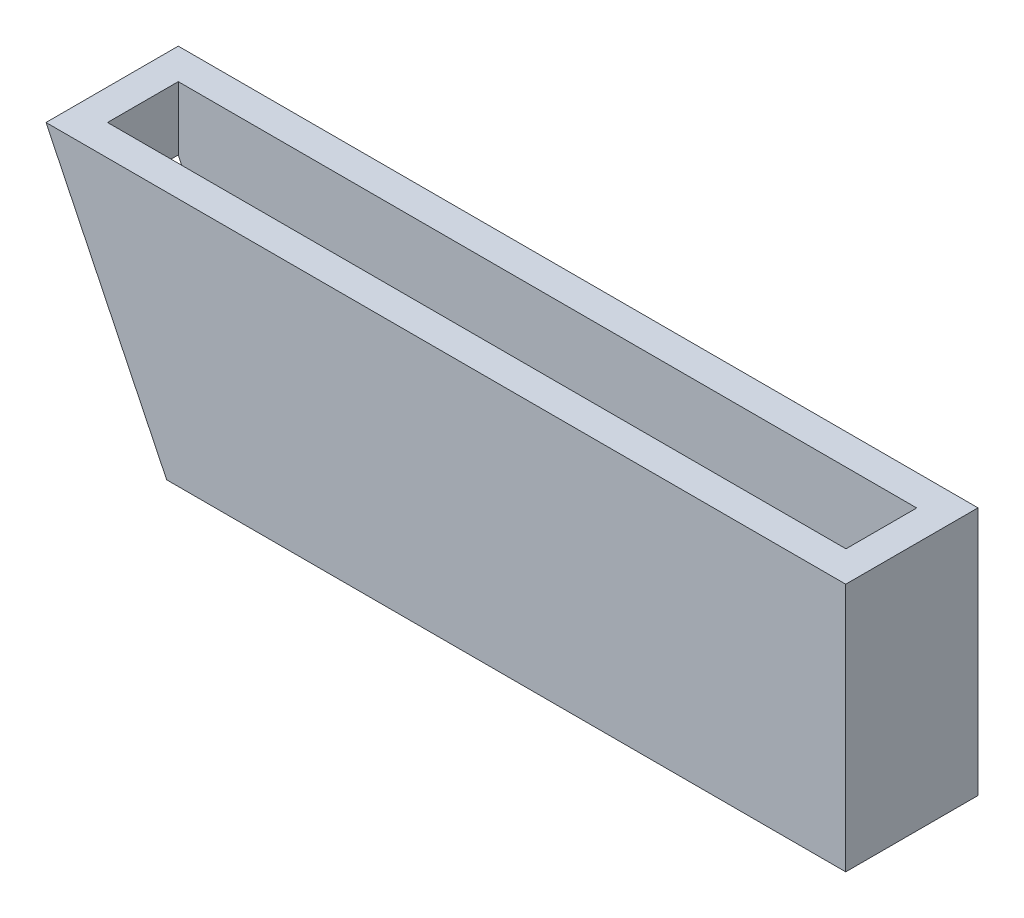
ISO-10303-21;
HEADER;
FILE_DESCRIPTION(('STEP AP214'),'2;1');
FILE_NAME('part.step','',(''),(''),'','','');
FILE_SCHEMA(('AUTOMOTIVE_DESIGN { 1 0 10303 214 1 1 1 1 }'));
ENDSEC;
DATA;
#1=APPLICATION_CONTEXT('core data for automotive mechanical design processes');
#2=APPLICATION_PROTOCOL_DEFINITION('international standard','automotive_design',2000,#1);
#3=PRODUCT_CONTEXT('',#1,'mechanical');
#4=PRODUCT('Part','Part','',(#3));
#5=PRODUCT_RELATED_PRODUCT_CATEGORY('part','',(#4));
#6=PRODUCT_DEFINITION_FORMATION('','',#4);
#7=PRODUCT_DEFINITION_CONTEXT('part definition',#1,'design');
#8=PRODUCT_DEFINITION('design','',#6,#7);
#9=PRODUCT_DEFINITION_SHAPE('','',#8);
#10=(LENGTH_UNIT() NAMED_UNIT(*) SI_UNIT(.MILLI.,.METRE.));
#11=(NAMED_UNIT(*) PLANE_ANGLE_UNIT() SI_UNIT($,.RADIAN.));
#12=(NAMED_UNIT(*) SI_UNIT($,.STERADIAN.) SOLID_ANGLE_UNIT());
#13=UNCERTAINTY_MEASURE_WITH_UNIT(LENGTH_MEASURE(1.E-05),#10,'distance_accuracy_value','');
#14=(GEOMETRIC_REPRESENTATION_CONTEXT(3) GLOBAL_UNCERTAINTY_ASSIGNED_CONTEXT((#13)) GLOBAL_UNIT_ASSIGNED_CONTEXT((#10,
#11,#12)) REPRESENTATION_CONTEXT('',''));
#15=CARTESIAN_POINT('',(0.,0.,0.));
#16=DIRECTION('',(0.,0.,1.));
#17=DIRECTION('',(1.,0.,0.));
#18=AXIS2_PLACEMENT_3D('',#15,#16,#17);
#19=CARTESIAN_POINT('',(0.,81.,10.));
#20=DIRECTION('',(0.,0.,-1.));
#21=DIRECTION('',(-1.,0.,0.));
#22=AXIS2_PLACEMENT_3D('',#19,#20,#21);
#23=PLANE('',#22);
#24=DIRECTION('',(1.,0.,0.));
#25=VECTOR('',#24,1.);
#26=CARTESIAN_POINT('',(0.,81.,10.));
#27=LINE('',#26,#25);
#28=CARTESIAN_POINT('',(0.,81.,10.0000000000001));
#29=VERTEX_POINT('',#28);
#30=CARTESIAN_POINT('',(260.,81.,10.));
#31=VERTEX_POINT('',#30);
#32=EDGE_CURVE('E126',#29,#31,#27,.T.);
#33=ORIENTED_EDGE('',*,*,#32,.F.);
#34=DIRECTION('',(0.435889894354068,-0.9,0.));
#35=VECTOR('',#34,1.);
#36=CARTESIAN_POINT('',(0.,81.,10.));
#37=LINE('',#36,#35);
#38=CARTESIAN_POINT('',(39.2300904918661,0.,10.0000000000001));
#39=VERTEX_POINT('',#38);
#40=EDGE_CURVE('E138',#29,#39,#37,.T.);
#41=ORIENTED_EDGE('',*,*,#40,.T.);
#42=DIRECTION('',(1.,0.,0.));
#43=VECTOR('',#42,1.);
#44=CARTESIAN_POINT('',(0.,0.,10.));
#45=LINE('',#44,#43);
#46=CARTESIAN_POINT('',(260.,0.,10.));
#47=VERTEX_POINT('',#46);
#48=EDGE_CURVE('E142',#39,#47,#45,.T.);
#49=ORIENTED_EDGE('',*,*,#48,.T.);
#50=DIRECTION('',(0.,-1.,0.));
#51=VECTOR('',#50,1.);
#52=CARTESIAN_POINT('',(260.,81.,10.));
#53=LINE('',#52,#51);
#54=EDGE_CURVE('E150',#31,#47,#53,.T.);
#55=ORIENTED_EDGE('',*,*,#54,.F.);
#56=EDGE_LOOP('',(#33,#41,#49,#55));
#57=FACE_BOUND('',#56,.T.);
#58=ADVANCED_FACE('F37',(#57),#23,.F.);
#59=CARTESIAN_POINT('',(260.,81.,0.));
#60=DIRECTION('',(-1.,0.,0.));
#61=DIRECTION('',(0.,0.,1.));
#62=AXIS2_PLACEMENT_3D('',#59,#60,#61);
#63=PLANE('',#62);
#64=DIRECTION('',(0.,0.,-1.));
#65=VECTOR('',#64,1.);
#66=CARTESIAN_POINT('',(260.,0.,0.));
#67=LINE('',#66,#65);
#68=CARTESIAN_POINT('',(260.,0.,-32.9985523775063));
#69=VERTEX_POINT('',#68);
#70=EDGE_CURVE('E144',#47,#69,#67,.T.);
#71=ORIENTED_EDGE('',*,*,#70,.T.);
#72=DIRECTION('',(0.,-1.,0.));
#73=VECTOR('',#72,1.);
#74=CARTESIAN_POINT('',(260.,81.,-32.9985523775063));
#75=LINE('',#74,#73);
#76=CARTESIAN_POINT('',(260.,81.,-32.9985523775063));
#77=VERTEX_POINT('',#76);
#78=EDGE_CURVE('E148',#77,#69,#75,.T.);
#79=ORIENTED_EDGE('',*,*,#78,.F.);
#80=DIRECTION('',(0.,0.,-1.));
#81=VECTOR('',#80,1.);
#82=CARTESIAN_POINT('',(260.,81.,0.));
#83=LINE('',#82,#81);
#84=EDGE_CURVE('E61',#31,#77,#83,.T.);
#85=ORIENTED_EDGE('',*,*,#84,.F.);
#86=ORIENTED_EDGE('',*,*,#54,.T.);
#87=EDGE_LOOP('',(#71,#79,#85,#86));
#88=FACE_BOUND('',#87,.T.);
#89=ADVANCED_FACE('F190',(#88),#63,.F.);
#90=CARTESIAN_POINT('',(0.,81.,0.));
#91=DIRECTION('',(0.,0.,-1.));
#92=DIRECTION('',(-1.,0.,0.));
#93=AXIS2_PLACEMENT_3D('',#90,#91,#92);
#94=PLANE('',#93);
#95=DIRECTION('',(0.435889894354068,-0.9,0.));
#96=VECTOR('',#95,1.);
#97=CARTESIAN_POINT('',(0.,81.,0.));
#98=LINE('',#97,#96);
#99=CARTESIAN_POINT('',(10.,60.3525839516494,0.));
#100=VERTEX_POINT('',#99);
#101=CARTESIAN_POINT('',(39.2300904918661,0.,0.));
#102=VERTEX_POINT('',#101);
#103=EDGE_CURVE('E182',#100,#102,#98,.T.);
#104=ORIENTED_EDGE('',*,*,#103,.F.);
#105=DIRECTION('',(0.,-1.,0.));
#106=VECTOR('',#105,1.);
#107=CARTESIAN_POINT('',(10.,81.,0.));
#108=LINE('',#107,#106);
#109=CARTESIAN_POINT('',(10.,81.,0.));
#110=VERTEX_POINT('',#109);
#111=EDGE_CURVE('E91',#110,#100,#108,.T.);
#112=ORIENTED_EDGE('',*,*,#111,.F.);
#113=DIRECTION('',(1.,0.,0.));
#114=VECTOR('',#113,1.);
#115=CARTESIAN_POINT('',(0.,81.,0.));
#116=LINE('',#115,#114);
#117=CARTESIAN_POINT('',(250.076193400082,81.,0.));
#118=VERTEX_POINT('',#117);
#119=EDGE_CURVE('E116',#110,#118,#116,.T.);
#120=ORIENTED_EDGE('',*,*,#119,.T.);
#121=DIRECTION('',(0.,-1.,0.));
#122=VECTOR('',#121,1.);
#123=CARTESIAN_POINT('',(250.076193400082,81.,0.));
#124=LINE('',#123,#122);
#125=CARTESIAN_POINT('',(250.076193400082,0.,0.));
#126=VERTEX_POINT('',#125);
#127=EDGE_CURVE('E105',#118,#126,#124,.T.);
#128=ORIENTED_EDGE('',*,*,#127,.T.);
#129=DIRECTION('',(1.,0.,0.));
#130=VECTOR('',#129,1.);
#131=CARTESIAN_POINT('',(0.,0.,0.));
#132=LINE('',#131,#130);
#133=EDGE_CURVE('E135',#102,#126,#132,.T.);
#134=ORIENTED_EDGE('',*,*,#133,.F.);
#135=EDGE_LOOP('',(#104,#112,#120,#128,#134));
#136=FACE_BOUND('',#135,.T.);
#137=ADVANCED_FACE('F39',(#136),#94,.T.);
#138=CARTESIAN_POINT('',(10.,81.,0.));
#139=DIRECTION('',(-1.,0.,0.));
#140=DIRECTION('',(0.,0.,1.));
#141=AXIS2_PLACEMENT_3D('',#138,#139,#140);
#142=PLANE('',#141);
#143=ORIENTED_EDGE('',*,*,#111,.T.);
#144=DIRECTION('',(0.,0.,-1.));
#145=VECTOR('',#144,1.);
#146=CARTESIAN_POINT('',(10.,60.3525839516494,0.));
#147=LINE('',#146,#145);
#148=CARTESIAN_POINT('',(10.,60.3525839516494,-23.));
#149=VERTEX_POINT('',#148);
#150=EDGE_CURVE('E162',#100,#149,#147,.T.);
#151=ORIENTED_EDGE('',*,*,#150,.T.);
#152=DIRECTION('',(0.,-1.,0.));
#153=VECTOR('',#152,1.);
#154=CARTESIAN_POINT('',(10.,81.,-23.));
#155=LINE('',#154,#153);
#156=CARTESIAN_POINT('',(10.,81.,-23.));
#157=VERTEX_POINT('',#156);
#158=EDGE_CURVE('E154',#157,#149,#155,.T.);
#159=ORIENTED_EDGE('',*,*,#158,.F.);
#160=DIRECTION('',(0.,0.,-1.));
#161=VECTOR('',#160,1.);
#162=CARTESIAN_POINT('',(10.,81.,0.));
#163=LINE('',#162,#161);
#164=EDGE_CURVE('E118',#110,#157,#163,.T.);
#165=ORIENTED_EDGE('',*,*,#164,.F.);
#166=EDGE_LOOP('',(#143,#151,#159,#165));
#167=FACE_BOUND('',#166,.T.);
#168=ADVANCED_FACE('F158',(#167),#142,.F.);
#169=CARTESIAN_POINT('',(0.,81.,-23.));
#170=DIRECTION('',(0.,0.,1.));
#171=DIRECTION('',(1.,0.,0.));
#172=AXIS2_PLACEMENT_3D('',#169,#170,#171);
#173=PLANE('',#172);
#174=DIRECTION('',(-0.435889894354068,0.9,0.));
#175=VECTOR('',#174,1.);
#176=CARTESIAN_POINT('',(0.,81.,-23.));
#177=LINE('',#176,#175);
#178=CARTESIAN_POINT('',(39.2300904918661,0.,-22.9999999999999));
#179=VERTEX_POINT('',#178);
#180=EDGE_CURVE('E167',#179,#149,#177,.T.);
#181=ORIENTED_EDGE('',*,*,#180,.F.);
#182=DIRECTION('',(-1.,0.,0.));
#183=VECTOR('',#182,1.);
#184=CARTESIAN_POINT('',(0.,0.,-23.));
#185=LINE('',#184,#183);
#186=CARTESIAN_POINT('',(250.076193400082,0.,-23.));
#187=VERTEX_POINT('',#186);
#188=EDGE_CURVE('E137',#187,#179,#185,.T.);
#189=ORIENTED_EDGE('',*,*,#188,.F.);
#190=DIRECTION('',(0.,-1.,0.));
#191=VECTOR('',#190,1.);
#192=CARTESIAN_POINT('',(250.076193400082,81.,-23.));
#193=LINE('',#192,#191);
#194=CARTESIAN_POINT('',(250.076193400082,81.,-23.));
#195=VERTEX_POINT('',#194);
#196=EDGE_CURVE('E112',#195,#187,#193,.T.);
#197=ORIENTED_EDGE('',*,*,#196,.F.);
#198=DIRECTION('',(-1.,0.,0.));
#199=VECTOR('',#198,1.);
#200=CARTESIAN_POINT('',(0.,81.,-23.));
#201=LINE('',#200,#199);
#202=EDGE_CURVE('E123',#195,#157,#201,.T.);
#203=ORIENTED_EDGE('',*,*,#202,.T.);
#204=ORIENTED_EDGE('',*,*,#158,.T.);
#205=EDGE_LOOP('',(#181,#189,#197,#203,#204));
#206=FACE_BOUND('',#205,.T.);
#207=ADVANCED_FACE('F198',(#206),#173,.T.);
#208=CARTESIAN_POINT('',(250.076193400082,81.,0.));
#209=DIRECTION('',(-1.,0.,0.));
#210=DIRECTION('',(0.,0.,1.));
#211=AXIS2_PLACEMENT_3D('',#208,#209,#210);
#212=PLANE('',#211);
#213=DIRECTION('',(0.,0.,-1.));
#214=VECTOR('',#213,1.);
#215=CARTESIAN_POINT('',(250.076193400082,0.,0.));
#216=LINE('',#215,#214);
#217=EDGE_CURVE('E110',#126,#187,#216,.T.);
#218=ORIENTED_EDGE('',*,*,#217,.F.);
#219=ORIENTED_EDGE('',*,*,#127,.F.);
#220=DIRECTION('',(0.,0.,-1.));
#221=VECTOR('',#220,1.);
#222=CARTESIAN_POINT('',(250.076193400082,81.,0.));
#223=LINE('',#222,#221);
#224=EDGE_CURVE('E108',#118,#195,#223,.T.);
#225=ORIENTED_EDGE('',*,*,#224,.T.);
#226=ORIENTED_EDGE('',*,*,#196,.T.);
#227=EDGE_LOOP('',(#218,#219,#225,#226));
#228=FACE_BOUND('',#227,.T.);
#229=ADVANCED_FACE('F106',(#228),#212,.T.);
#230=CARTESIAN_POINT('',(0.,81.,-32.9985523775063));
#231=DIRECTION('',(0.,0.,-1.));
#232=DIRECTION('',(-1.,0.,0.));
#233=AXIS2_PLACEMENT_3D('',#230,#231,#232);
#234=PLANE('',#233);
#235=DIRECTION('',(0.435889894354068,-0.9,0.));
#236=VECTOR('',#235,1.);
#237=CARTESIAN_POINT('',(0.,81.,-32.9985523775063));
#238=LINE('',#237,#236);
#239=CARTESIAN_POINT('',(0.,81.,-32.9985523775062));
#240=VERTEX_POINT('',#239);
#241=CARTESIAN_POINT('',(39.2300904918661,0.,-32.9985523775063));
#242=VERTEX_POINT('',#241);
#243=EDGE_CURVE('E52',#240,#242,#238,.T.);
#244=ORIENTED_EDGE('',*,*,#243,.F.);
#245=DIRECTION('',(1.,0.,0.));
#246=VECTOR('',#245,1.);
#247=CARTESIAN_POINT('',(0.,81.,-32.9985523775063));
#248=LINE('',#247,#246);
#249=EDGE_CURVE('E113',#240,#77,#248,.T.);
#250=ORIENTED_EDGE('',*,*,#249,.T.);
#251=ORIENTED_EDGE('',*,*,#78,.T.);
#252=DIRECTION('',(1.,0.,0.));
#253=VECTOR('',#252,1.);
#254=CARTESIAN_POINT('',(0.,0.,-32.9985523775063));
#255=LINE('',#254,#253);
#256=EDGE_CURVE('E82',#242,#69,#255,.T.);
#257=ORIENTED_EDGE('',*,*,#256,.F.);
#258=EDGE_LOOP('',(#244,#250,#251,#257));
#259=FACE_BOUND('',#258,.T.);
#260=ADVANCED_FACE('F192',(#259),#234,.T.);
#261=CARTESIAN_POINT('',(0.,81.,0.));
#262=DIRECTION('',(0.,1.,0.));
#263=DIRECTION('',(0.,0.,1.));
#264=AXIS2_PLACEMENT_3D('',#261,#262,#263);
#265=PLANE('',#264);
#266=ORIENTED_EDGE('',*,*,#119,.F.);
#267=ORIENTED_EDGE('',*,*,#164,.T.);
#268=ORIENTED_EDGE('',*,*,#202,.F.);
#269=ORIENTED_EDGE('',*,*,#224,.F.);
#270=EDGE_LOOP('',(#266,#267,#268,#269));
#271=FACE_BOUND('',#270,.T.);
#272=DIRECTION('',(0.,0.,-1.));
#273=VECTOR('',#272,1.);
#274=CARTESIAN_POINT('',(0.,81.,0.));
#275=LINE('',#274,#273);
#276=EDGE_CURVE('E124',#29,#240,#275,.T.);
#277=ORIENTED_EDGE('',*,*,#276,.F.);
#278=ORIENTED_EDGE('',*,*,#32,.T.);
#279=ORIENTED_EDGE('',*,*,#84,.T.);
#280=ORIENTED_EDGE('',*,*,#249,.F.);
#281=EDGE_LOOP('',(#277,#278,#279,#280));
#282=FACE_BOUND('',#281,.T.);
#283=ADVANCED_FACE('F121',(#271,#282),#265,.T.);
#284=CARTESIAN_POINT('',(0.,0.,0.));
#285=DIRECTION('',(0.,1.,0.));
#286=DIRECTION('',(0.,0.,1.));
#287=AXIS2_PLACEMENT_3D('',#284,#285,#286);
#288=PLANE('',#287);
#289=ORIENTED_EDGE('',*,*,#48,.F.);
#290=DIRECTION('',(0.,0.,-1.));
#291=VECTOR('',#290,1.);
#292=CARTESIAN_POINT('',(39.2300904918661,0.,0.));
#293=LINE('',#292,#291);
#294=EDGE_CURVE('E11',#39,#102,#293,.T.);
#295=ORIENTED_EDGE('',*,*,#294,.T.);
#296=ORIENTED_EDGE('',*,*,#133,.T.);
#297=ORIENTED_EDGE('',*,*,#217,.T.);
#298=ORIENTED_EDGE('',*,*,#188,.T.);
#299=EDGE_CURVE('E41',#179,#242,#293,.T.);
#300=ORIENTED_EDGE('',*,*,#299,.T.);
#301=ORIENTED_EDGE('',*,*,#256,.T.);
#302=ORIENTED_EDGE('',*,*,#70,.F.);
#303=EDGE_LOOP('',(#289,#295,#296,#297,#298,#300,#301,#302));
#304=FACE_BOUND('',#303,.T.);
#305=ADVANCED_FACE('F188',(#304),#288,.F.);
#306=CARTESIAN_POINT('',(31.7763732984115,15.39,194.001447622494));
#307=DIRECTION('',(0.9,0.435889894354067,0.));
#308=DIRECTION('',(-0.435889894354068,0.9,0.));
#309=AXIS2_PLACEMENT_3D('',#306,#307,#308);
#310=PLANE('',#309);
#311=ORIENTED_EDGE('',*,*,#276,.T.);
#312=ORIENTED_EDGE('',*,*,#243,.T.);
#313=ORIENTED_EDGE('',*,*,#299,.F.);
#314=ORIENTED_EDGE('',*,*,#180,.T.);
#315=ORIENTED_EDGE('',*,*,#150,.F.);
#316=ORIENTED_EDGE('',*,*,#103,.T.);
#317=ORIENTED_EDGE('',*,*,#294,.F.);
#318=ORIENTED_EDGE('',*,*,#40,.F.);
#319=EDGE_LOOP('',(#311,#312,#313,#314,#315,#316,#317,#318));
#320=FACE_BOUND('',#319,.T.);
#321=ADVANCED_FACE('F180',(#320),#310,.F.);
#322=CLOSED_SHELL('',(#58,#89,#137,#168,#207,#229,#260,#283,#305,#321));
#323=MANIFOLD_SOLID_BREP('B2',#322);
#324=ADVANCED_BREP_SHAPE_REPRESENTATION('',(#18,#323),#14);
#325=SHAPE_DEFINITION_REPRESENTATION(#9,#324);
ENDSEC;
END-ISO-10303-21;
